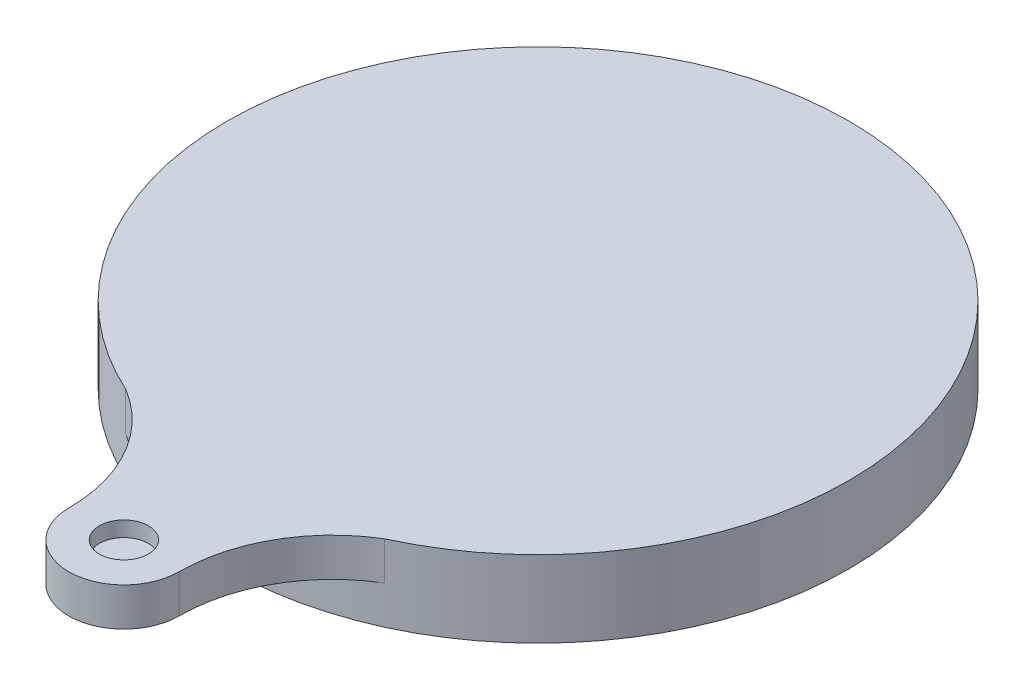
ISO-10303-21;
HEADER;
FILE_DESCRIPTION(('STEP AP214'),'2;1');
FILE_NAME('part.step','',(''),(''),'','','');
FILE_SCHEMA(('AUTOMOTIVE_DESIGN { 1 0 10303 214 1 1 1 1 }'));
ENDSEC;
DATA;
#1=APPLICATION_CONTEXT('core data for automotive mechanical design processes');
#2=APPLICATION_PROTOCOL_DEFINITION('international standard','automotive_design',2000,#1);
#3=PRODUCT_CONTEXT('',#1,'mechanical');
#4=PRODUCT('Part','Part','',(#3));
#5=PRODUCT_RELATED_PRODUCT_CATEGORY('part','',(#4));
#6=PRODUCT_DEFINITION_FORMATION('','',#4);
#7=PRODUCT_DEFINITION_CONTEXT('part definition',#1,'design');
#8=PRODUCT_DEFINITION('design','',#6,#7);
#9=PRODUCT_DEFINITION_SHAPE('','',#8);
#10=(LENGTH_UNIT() NAMED_UNIT(*) SI_UNIT(.MILLI.,.METRE.));
#11=(NAMED_UNIT(*) PLANE_ANGLE_UNIT() SI_UNIT($,.RADIAN.));
#12=(NAMED_UNIT(*) SI_UNIT($,.STERADIAN.) SOLID_ANGLE_UNIT());
#13=UNCERTAINTY_MEASURE_WITH_UNIT(LENGTH_MEASURE(1.E-05),#10,'distance_accuracy_value','');
#14=(GEOMETRIC_REPRESENTATION_CONTEXT(3) GLOBAL_UNCERTAINTY_ASSIGNED_CONTEXT((#13)) GLOBAL_UNIT_ASSIGNED_CONTEXT((#10,
#11,#12)) REPRESENTATION_CONTEXT('',''));
#15=CARTESIAN_POINT('',(0.,0.,0.));
#16=DIRECTION('',(0.,0.,1.));
#17=DIRECTION('',(1.,0.,0.));
#18=AXIS2_PLACEMENT_3D('',#15,#16,#17);
#19=CARTESIAN_POINT('',(0.,50.,0.));
#20=DIRECTION('',(0.,-1.,0.));
#21=DIRECTION('',(0.,0.,-1.));
#22=AXIS2_PLACEMENT_3D('',#19,#20,#21);
#23=CYLINDRICAL_SURFACE('',#22,203.);
#24=CARTESIAN_POINT('',(0.,25.,0.));
#25=DIRECTION('',(0.,-1.,0.));
#26=DIRECTION('',(0.,0.,1.));
#27=AXIS2_PLACEMENT_3D('',#24,#25,#26);
#28=CIRCLE('',#27,203.);
#29=CARTESIAN_POINT('',(84.507,25.,184.574014831449));
#30=VERTEX_POINT('',#29);
#31=CARTESIAN_POINT('',(-84.507,25.,184.574014831449));
#32=VERTEX_POINT('',#31);
#33=EDGE_CURVE('E94',#30,#32,#28,.T.);
#34=ORIENTED_EDGE('',*,*,#33,.T.);
#35=DIRECTION('',(0.,1.,0.));
#36=VECTOR('',#35,1.);
#37=CARTESIAN_POINT('',(-84.507,25.,184.574014831449));
#38=LINE('',#37,#36);
#39=CARTESIAN_POINT('',(-84.507,50.,184.574014831449));
#40=VERTEX_POINT('',#39);
#41=EDGE_CURVE('E58',#32,#40,#38,.T.);
#42=ORIENTED_EDGE('',*,*,#41,.T.);
#43=CARTESIAN_POINT('',(0.,50.,0.));
#44=DIRECTION('',(0.,1.,0.));
#45=DIRECTION('',(0.,0.,1.));
#46=AXIS2_PLACEMENT_3D('',#43,#44,#45);
#47=CIRCLE('',#46,203.);
#48=CARTESIAN_POINT('',(84.5069999999994,50.,184.574014831449));
#49=VERTEX_POINT('',#48);
#50=EDGE_CURVE('E11',#49,#40,#47,.T.);
#51=ORIENTED_EDGE('',*,*,#50,.F.);
#52=DIRECTION('',(0.,1.,0.));
#53=VECTOR('',#52,1.);
#54=CARTESIAN_POINT('',(84.507,25.,184.574014831449));
#55=LINE('',#54,#53);
#56=EDGE_CURVE('E88',#30,#49,#55,.T.);
#57=ORIENTED_EDGE('',*,*,#56,.F.);
#58=EDGE_LOOP('',(#34,#42,#51,#57));
#59=FACE_BOUND('',#58,.T.);
#60=CARTESIAN_POINT('',(0.,0.,0.));
#61=DIRECTION('',(0.,1.,0.));
#62=DIRECTION('',(0.,0.,1.));
#63=AXIS2_PLACEMENT_3D('',#60,#61,#62);
#64=CIRCLE('',#63,203.);
#65=CARTESIAN_POINT('',(0.,0.,203.));
#66=VERTEX_POINT('',#65);
#67=EDGE_CURVE('E39',#66,#66,#64,.T.);
#68=ORIENTED_EDGE('',*,*,#67,.T.);
#69=EDGE_LOOP('',(#68));
#70=FACE_BOUND('',#69,.T.);
#71=ADVANCED_FACE('F36',(#59,#70),#23,.T.);
#72=CARTESIAN_POINT('',(0.,50.,0.));
#73=DIRECTION('',(0.,1.,0.));
#74=DIRECTION('',(0.,0.,1.));
#75=AXIS2_PLACEMENT_3D('',#72,#73,#74);
#76=PLANE('',#75);
#77=CARTESIAN_POINT('',(0.,50.,270.29723777016));
#78=DIRECTION('',(0.,1.,0.));
#79=DIRECTION('',(0.,0.,1.));
#80=AXIS2_PLACEMENT_3D('',#77,#78,#79);
#81=CIRCLE('',#80,16.);
#82=CARTESIAN_POINT('',(0.,50.,286.29723777016));
#83=VERTEX_POINT('',#82);
#84=EDGE_CURVE('E147',#83,#83,#81,.T.);
#85=ORIENTED_EDGE('',*,*,#84,.F.);
#86=EDGE_LOOP('',(#85));
#87=FACE_BOUND('',#86,.T.);
#88=ORIENTED_EDGE('',*,*,#50,.T.);
#89=CARTESIAN_POINT('',(-136.,50.,270.29723777016));
#90=DIRECTION('',(0.,-1.,0.));
#91=DIRECTION('',(0.,0.,1.));
#92=AXIS2_PLACEMENT_3D('',#89,#90,#91);
#93=CIRCLE('',#92,99.9999999999999);
#94=CARTESIAN_POINT('',(-36.0000000000001,50.,270.29723777016));
#95=VERTEX_POINT('',#94);
#96=EDGE_CURVE('E73',#40,#95,#93,.T.);
#97=ORIENTED_EDGE('',*,*,#96,.T.);
#98=CARTESIAN_POINT('',(0.,50.,270.29723777016));
#99=DIRECTION('',(0.,1.,0.));
#100=DIRECTION('',(0.,0.,1.));
#101=AXIS2_PLACEMENT_3D('',#98,#99,#100);
#102=CIRCLE('',#101,36.0000000000001);
#103=CARTESIAN_POINT('',(36.0000000000001,50.,270.29723777016));
#104=VERTEX_POINT('',#103);
#105=EDGE_CURVE('E105',#95,#104,#102,.T.);
#106=ORIENTED_EDGE('',*,*,#105,.T.);
#107=CARTESIAN_POINT('',(136.,50.,270.29723777016));
#108=DIRECTION('',(0.,-1.,0.));
#109=DIRECTION('',(0.,0.,-1.));
#110=AXIS2_PLACEMENT_3D('',#107,#108,#109);
#111=CIRCLE('',#110,99.9999999999999);
#112=EDGE_CURVE('E49',#104,#49,#111,.T.);
#113=ORIENTED_EDGE('',*,*,#112,.T.);
#114=EDGE_LOOP('',(#88,#97,#106,#113));
#115=FACE_BOUND('',#114,.T.);
#116=ADVANCED_FACE('F112',(#87,#115),#76,.T.);
#117=CARTESIAN_POINT('',(0.,0.,0.));
#118=DIRECTION('',(0.,1.,0.));
#119=DIRECTION('',(0.,0.,1.));
#120=AXIS2_PLACEMENT_3D('',#117,#118,#119);
#121=PLANE('',#120);
#122=ORIENTED_EDGE('',*,*,#67,.F.);
#123=EDGE_LOOP('',(#122));
#124=FACE_BOUND('',#123,.T.);
#125=ADVANCED_FACE('F120',(#124),#121,.F.);
#126=CARTESIAN_POINT('',(-136.,25.,270.29723777016));
#127=DIRECTION('',(0.,1.,0.));
#128=DIRECTION('',(0.,0.,1.));
#129=AXIS2_PLACEMENT_3D('',#126,#127,#128);
#130=CYLINDRICAL_SURFACE('',#129,99.9999999999999);
#131=ORIENTED_EDGE('',*,*,#96,.F.);
#132=ORIENTED_EDGE('',*,*,#41,.F.);
#133=CARTESIAN_POINT('',(-136.,25.,270.29723777016));
#134=DIRECTION('',(0.,-1.,0.));
#135=DIRECTION('',(0.,0.,1.));
#136=AXIS2_PLACEMENT_3D('',#133,#134,#135);
#137=CIRCLE('',#136,99.9999999999999);
#138=CARTESIAN_POINT('',(-36.0000000000001,25.,270.29723777016));
#139=VERTEX_POINT('',#138);
#140=EDGE_CURVE('E98',#32,#139,#137,.T.);
#141=ORIENTED_EDGE('',*,*,#140,.T.);
#142=DIRECTION('',(0.,1.,0.));
#143=VECTOR('',#142,1.);
#144=CARTESIAN_POINT('',(-36.0000000000001,25.,270.29723777016));
#145=LINE('',#144,#143);
#146=EDGE_CURVE('E79',#139,#95,#145,.T.);
#147=ORIENTED_EDGE('',*,*,#146,.T.);
#148=EDGE_LOOP('',(#131,#132,#141,#147));
#149=FACE_BOUND('',#148,.T.);
#150=ADVANCED_FACE('F111',(#149),#130,.F.);
#151=CARTESIAN_POINT('',(136.,25.,270.29723777016));
#152=DIRECTION('',(0.,1.,0.));
#153=DIRECTION('',(0.,0.,1.));
#154=AXIS2_PLACEMENT_3D('',#151,#152,#153);
#155=CYLINDRICAL_SURFACE('',#154,99.9999999999999);
#156=ORIENTED_EDGE('',*,*,#112,.F.);
#157=DIRECTION('',(0.,1.,0.));
#158=VECTOR('',#157,1.);
#159=CARTESIAN_POINT('',(36.0000000000001,25.,270.29723777016));
#160=LINE('',#159,#158);
#161=CARTESIAN_POINT('',(36.0000000000001,25.,270.29723777016));
#162=VERTEX_POINT('',#161);
#163=EDGE_CURVE('E83',#162,#104,#160,.T.);
#164=ORIENTED_EDGE('',*,*,#163,.F.);
#165=CARTESIAN_POINT('',(136.,25.,270.29723777016));
#166=DIRECTION('',(0.,-1.,0.));
#167=DIRECTION('',(0.,0.,-1.));
#168=AXIS2_PLACEMENT_3D('',#165,#166,#167);
#169=CIRCLE('',#168,99.9999999999999);
#170=EDGE_CURVE('E86',#162,#30,#169,.T.);
#171=ORIENTED_EDGE('',*,*,#170,.T.);
#172=ORIENTED_EDGE('',*,*,#56,.T.);
#173=EDGE_LOOP('',(#156,#164,#171,#172));
#174=FACE_BOUND('',#173,.T.);
#175=ADVANCED_FACE('F85',(#174),#155,.F.);
#176=CARTESIAN_POINT('',(0.,25.,270.29723777016));
#177=DIRECTION('',(0.,1.,0.));
#178=DIRECTION('',(0.,0.,1.));
#179=AXIS2_PLACEMENT_3D('',#176,#177,#178);
#180=CYLINDRICAL_SURFACE('',#179,36.0000000000001);
#181=ORIENTED_EDGE('',*,*,#105,.F.);
#182=ORIENTED_EDGE('',*,*,#146,.F.);
#183=CARTESIAN_POINT('',(0.,25.,270.29723777016));
#184=DIRECTION('',(0.,1.,0.));
#185=DIRECTION('',(0.,0.,1.));
#186=AXIS2_PLACEMENT_3D('',#183,#184,#185);
#187=CIRCLE('',#186,36.0000000000001);
#188=EDGE_CURVE('E92',#139,#162,#187,.T.);
#189=ORIENTED_EDGE('',*,*,#188,.T.);
#190=ORIENTED_EDGE('',*,*,#163,.T.);
#191=EDGE_LOOP('',(#181,#182,#189,#190));
#192=FACE_BOUND('',#191,.T.);
#193=ADVANCED_FACE('F97',(#192),#180,.T.);
#194=CARTESIAN_POINT('',(-68.,25.,135.14861888508));
#195=DIRECTION('',(0.,1.,0.));
#196=DIRECTION('',(0.,0.,1.));
#197=AXIS2_PLACEMENT_3D('',#194,#195,#196);
#198=PLANE('',#197);
#199=ORIENTED_EDGE('',*,*,#140,.F.);
#200=ORIENTED_EDGE('',*,*,#33,.F.);
#201=ORIENTED_EDGE('',*,*,#170,.F.);
#202=ORIENTED_EDGE('',*,*,#188,.F.);
#203=EDGE_LOOP('',(#199,#200,#201,#202));
#204=FACE_BOUND('',#203,.T.);
#205=ADVANCED_FACE('F91',(#204),#198,.F.);
#206=CARTESIAN_POINT('',(0.,40.,270.29723777016));
#207=DIRECTION('',(0.,1.,0.));
#208=DIRECTION('',(0.,0.,1.));
#209=AXIS2_PLACEMENT_3D('',#206,#207,#208);
#210=CYLINDRICAL_SURFACE('',#209,16.);
#211=CARTESIAN_POINT('',(0.,40.,270.29723777016));
#212=DIRECTION('',(0.,1.,0.));
#213=DIRECTION('',(0.,0.,1.));
#214=AXIS2_PLACEMENT_3D('',#211,#212,#213);
#215=CIRCLE('',#214,16.);
#216=CARTESIAN_POINT('',(0.,40.,286.29723777016));
#217=VERTEX_POINT('',#216);
#218=EDGE_CURVE('E106',#217,#217,#215,.T.);
#219=ORIENTED_EDGE('',*,*,#218,.F.);
#220=EDGE_LOOP('',(#219));
#221=FACE_BOUND('',#220,.T.);
#222=ORIENTED_EDGE('',*,*,#84,.T.);
#223=EDGE_LOOP('',(#222));
#224=FACE_BOUND('',#223,.T.);
#225=ADVANCED_FACE('F136',(#221,#224),#210,.F.);
#226=CARTESIAN_POINT('',(0.,40.,270.29723777016));
#227=DIRECTION('',(0.,1.,0.));
#228=DIRECTION('',(0.,0.,1.));
#229=AXIS2_PLACEMENT_3D('',#226,#227,#228);
#230=PLANE('',#229);
#231=ORIENTED_EDGE('',*,*,#218,.T.);
#232=EDGE_LOOP('',(#231));
#233=FACE_BOUND('',#232,.T.);
#234=ADVANCED_FACE('F139',(#233),#230,.T.);
#235=CLOSED_SHELL('',(#71,#116,#125,#150,#175,#193,#205,#225,#234));
#236=MANIFOLD_SOLID_BREP('B2',#235);
#237=ADVANCED_BREP_SHAPE_REPRESENTATION('',(#18,#236),#14);
#238=SHAPE_DEFINITION_REPRESENTATION(#9,#237);
ENDSEC;
END-ISO-10303-21;
